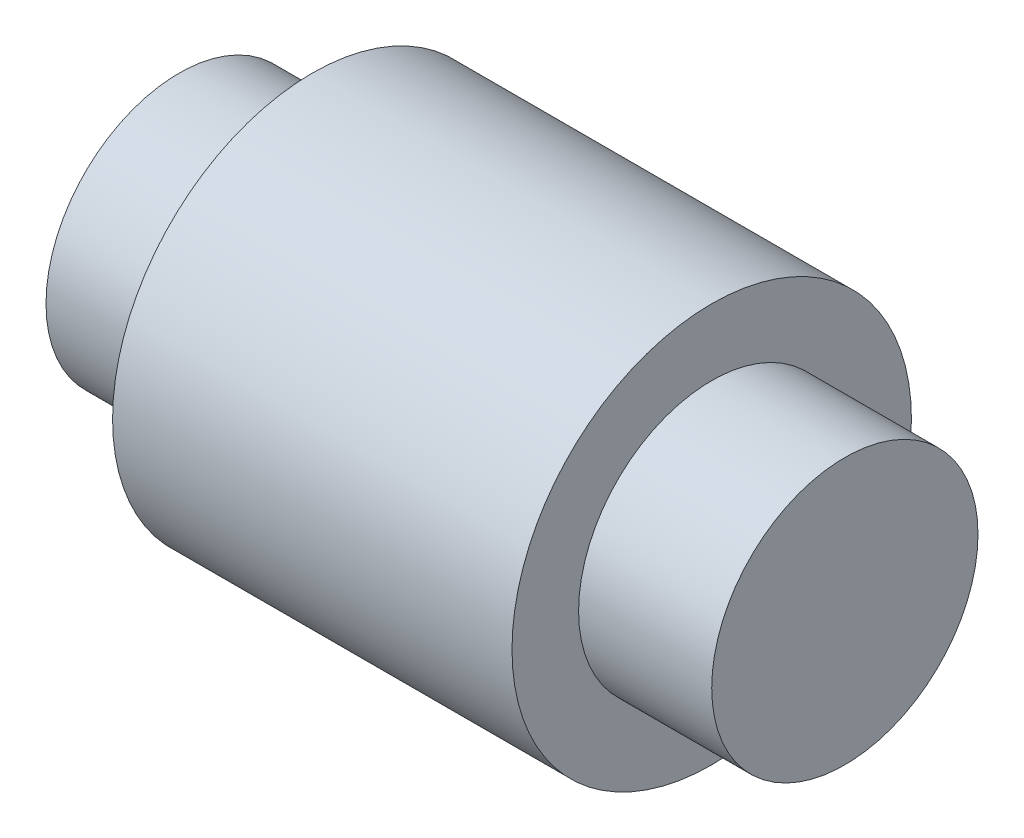
ISO-10303-21;
HEADER;
FILE_DESCRIPTION(('STEP AP214'),'2;1');
FILE_NAME('part.step','',(''),(''),'','','');
FILE_SCHEMA(('AUTOMOTIVE_DESIGN { 1 0 10303 214 1 1 1 1 }'));
ENDSEC;
DATA;
#1=APPLICATION_CONTEXT('core data for automotive mechanical design processes');
#2=APPLICATION_PROTOCOL_DEFINITION('international standard','automotive_design',2000,#1);
#3=PRODUCT_CONTEXT('',#1,'mechanical');
#4=PRODUCT('Part','Part','',(#3));
#5=PRODUCT_RELATED_PRODUCT_CATEGORY('part','',(#4));
#6=PRODUCT_DEFINITION_FORMATION('','',#4);
#7=PRODUCT_DEFINITION_CONTEXT('part definition',#1,'design');
#8=PRODUCT_DEFINITION('design','',#6,#7);
#9=PRODUCT_DEFINITION_SHAPE('','',#8);
#10=(LENGTH_UNIT() NAMED_UNIT(*) SI_UNIT(.MILLI.,.METRE.));
#11=(NAMED_UNIT(*) PLANE_ANGLE_UNIT() SI_UNIT($,.RADIAN.));
#12=(NAMED_UNIT(*) SI_UNIT($,.STERADIAN.) SOLID_ANGLE_UNIT());
#13=UNCERTAINTY_MEASURE_WITH_UNIT(LENGTH_MEASURE(1.E-05),#10,'distance_accuracy_value','');
#14=(GEOMETRIC_REPRESENTATION_CONTEXT(3) GLOBAL_UNCERTAINTY_ASSIGNED_CONTEXT((#13)) GLOBAL_UNIT_ASSIGNED_CONTEXT((#10,
#11,#12)) REPRESENTATION_CONTEXT('',''));
#15=CARTESIAN_POINT('',(0.,0.,0.));
#16=DIRECTION('',(0.,0.,1.));
#17=DIRECTION('',(1.,0.,0.));
#18=AXIS2_PLACEMENT_3D('',#15,#16,#17);
#19=CARTESIAN_POINT('',(0.,0.,0.));
#20=DIRECTION('',(1.,0.,0.));
#21=DIRECTION('',(0.,0.,-1.));
#22=AXIS2_PLACEMENT_3D('',#19,#20,#21);
#23=PLANE('',#22);
#24=CARTESIAN_POINT('',(0.,0.,0.));
#25=DIRECTION('',(-1.,0.,0.));
#26=DIRECTION('',(0.,0.,1.));
#27=AXIS2_PLACEMENT_3D('',#24,#25,#26);
#28=CIRCLE('',#27,20.);
#29=CARTESIAN_POINT('',(0.,0.,20.));
#30=VERTEX_POINT('',#29);
#31=EDGE_CURVE('E10',#30,#30,#28,.T.);
#32=ORIENTED_EDGE('',*,*,#31,.T.);
#33=EDGE_LOOP('',(#32));
#34=FACE_BOUND('',#33,.T.);
#35=ADVANCED_FACE('F37',(#34),#23,.F.);
#36=CARTESIAN_POINT('',(0.,0.,0.));
#37=DIRECTION('',(-1.,0.,0.));
#38=DIRECTION('',(0.,0.,1.));
#39=AXIS2_PLACEMENT_3D('',#36,#37,#38);
#40=CYLINDRICAL_SURFACE('',#39,20.);
#41=ORIENTED_EDGE('',*,*,#31,.F.);
#42=EDGE_LOOP('',(#41));
#43=FACE_BOUND('',#42,.T.);
#44=CARTESIAN_POINT('',(20.,0.,0.));
#45=DIRECTION('',(-1.,0.,0.));
#46=DIRECTION('',(0.,0.,1.));
#47=AXIS2_PLACEMENT_3D('',#44,#45,#46);
#48=CIRCLE('',#47,20.);
#49=CARTESIAN_POINT('',(20.,0.,20.));
#50=VERTEX_POINT('',#49);
#51=EDGE_CURVE('E43',#50,#50,#48,.T.);
#52=ORIENTED_EDGE('',*,*,#51,.T.);
#53=EDGE_LOOP('',(#52));
#54=FACE_BOUND('',#53,.T.);
#55=ADVANCED_FACE('F75',(#43,#54),#40,.T.);
#56=CARTESIAN_POINT('',(20.,20.,0.));
#57=DIRECTION('',(1.,0.,0.));
#58=DIRECTION('',(0.,0.,-1.));
#59=AXIS2_PLACEMENT_3D('',#56,#57,#58);
#60=PLANE('',#59);
#61=ORIENTED_EDGE('',*,*,#51,.F.);
#62=EDGE_LOOP('',(#61));
#63=FACE_BOUND('',#62,.T.);
#64=CARTESIAN_POINT('',(20.,0.,0.));
#65=DIRECTION('',(-1.,0.,0.));
#66=DIRECTION('',(0.,0.,1.));
#67=AXIS2_PLACEMENT_3D('',#64,#65,#66);
#68=CIRCLE('',#67,30.);
#69=CARTESIAN_POINT('',(20.,0.,30.));
#70=VERTEX_POINT('',#69);
#71=EDGE_CURVE('E47',#70,#70,#68,.T.);
#72=ORIENTED_EDGE('',*,*,#71,.T.);
#73=EDGE_LOOP('',(#72));
#74=FACE_BOUND('',#73,.T.);
#75=ADVANCED_FACE('F79',(#63,#74),#60,.F.);
#76=CARTESIAN_POINT('',(0.,0.,0.));
#77=DIRECTION('',(-1.,0.,0.));
#78=DIRECTION('',(0.,0.,1.));
#79=AXIS2_PLACEMENT_3D('',#76,#77,#78);
#80=CYLINDRICAL_SURFACE('',#79,30.);
#81=ORIENTED_EDGE('',*,*,#71,.F.);
#82=EDGE_LOOP('',(#81));
#83=FACE_BOUND('',#82,.T.);
#84=CARTESIAN_POINT('',(80.,0.,0.));
#85=DIRECTION('',(-1.,0.,0.));
#86=DIRECTION('',(0.,0.,1.));
#87=AXIS2_PLACEMENT_3D('',#84,#85,#86);
#88=CIRCLE('',#87,30.);
#89=CARTESIAN_POINT('',(80.,0.,30.));
#90=VERTEX_POINT('',#89);
#91=EDGE_CURVE('E51',#90,#90,#88,.T.);
#92=ORIENTED_EDGE('',*,*,#91,.T.);
#93=EDGE_LOOP('',(#92));
#94=FACE_BOUND('',#93,.T.);
#95=ADVANCED_FACE('F84',(#83,#94),#80,.T.);
#96=CARTESIAN_POINT('',(80.,30.,0.));
#97=DIRECTION('',(-1.,0.,0.));
#98=DIRECTION('',(0.,0.,1.));
#99=AXIS2_PLACEMENT_3D('',#96,#97,#98);
#100=PLANE('',#99);
#101=ORIENTED_EDGE('',*,*,#91,.F.);
#102=EDGE_LOOP('',(#101));
#103=FACE_BOUND('',#102,.T.);
#104=CARTESIAN_POINT('',(80.,0.,0.));
#105=DIRECTION('',(-1.,0.,0.));
#106=DIRECTION('',(0.,0.,1.));
#107=AXIS2_PLACEMENT_3D('',#104,#105,#106);
#108=CIRCLE('',#107,20.);
#109=CARTESIAN_POINT('',(80.,0.,20.));
#110=VERTEX_POINT('',#109);
#111=EDGE_CURVE('E56',#110,#110,#108,.T.);
#112=ORIENTED_EDGE('',*,*,#111,.T.);
#113=EDGE_LOOP('',(#112));
#114=FACE_BOUND('',#113,.T.);
#115=ADVANCED_FACE('F71',(#103,#114),#100,.F.);
#116=CARTESIAN_POINT('',(0.,0.,0.));
#117=DIRECTION('',(-1.,0.,0.));
#118=DIRECTION('',(0.,0.,1.));
#119=AXIS2_PLACEMENT_3D('',#116,#117,#118);
#120=CYLINDRICAL_SURFACE('',#119,20.);
#121=ORIENTED_EDGE('',*,*,#111,.F.);
#122=EDGE_LOOP('',(#121));
#123=FACE_BOUND('',#122,.T.);
#124=CARTESIAN_POINT('',(100.,0.,0.));
#125=DIRECTION('',(-1.,0.,0.));
#126=DIRECTION('',(0.,0.,1.));
#127=AXIS2_PLACEMENT_3D('',#124,#125,#126);
#128=CIRCLE('',#127,20.);
#129=CARTESIAN_POINT('',(100.,0.,20.));
#130=VERTEX_POINT('',#129);
#131=EDGE_CURVE('E59',#130,#130,#128,.T.);
#132=ORIENTED_EDGE('',*,*,#131,.T.);
#133=EDGE_LOOP('',(#132));
#134=FACE_BOUND('',#133,.T.);
#135=ADVANCED_FACE('F63',(#123,#134),#120,.T.);
#136=CARTESIAN_POINT('',(100.,0.,0.));
#137=DIRECTION('',(-1.,0.,0.));
#138=DIRECTION('',(0.,0.,1.));
#139=AXIS2_PLACEMENT_3D('',#136,#137,#138);
#140=PLANE('',#139);
#141=ORIENTED_EDGE('',*,*,#131,.F.);
#142=EDGE_LOOP('',(#141));
#143=FACE_BOUND('',#142,.T.);
#144=ADVANCED_FACE('F65',(#143),#140,.F.);
#145=CLOSED_SHELL('',(#35,#55,#75,#95,#115,#135,#144));
#146=MANIFOLD_SOLID_BREP('B2',#145);
#147=ADVANCED_BREP_SHAPE_REPRESENTATION('',(#18,#146),#14);
#148=SHAPE_DEFINITION_REPRESENTATION(#9,#147);
ENDSEC;
END-ISO-10303-21;
